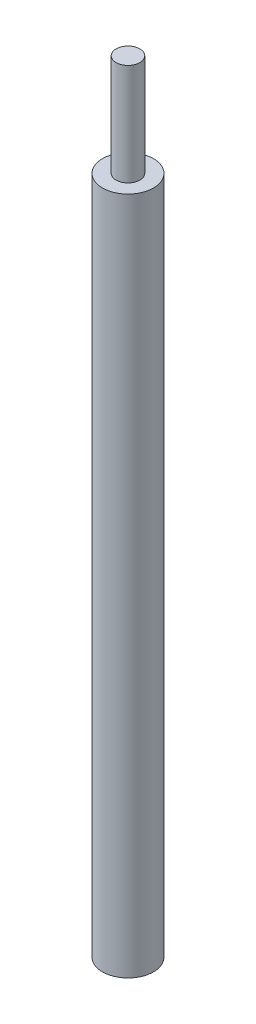
ISO-10303-21;
HEADER;
FILE_DESCRIPTION(('STEP AP214'),'2;1');
FILE_NAME('part.step','',(''),(''),'','','');
FILE_SCHEMA(('AUTOMOTIVE_DESIGN { 1 0 10303 214 1 1 1 1 }'));
ENDSEC;
DATA;
#1=APPLICATION_CONTEXT('core data for automotive mechanical design processes');
#2=APPLICATION_PROTOCOL_DEFINITION('international standard','automotive_design',2000,#1);
#3=PRODUCT_CONTEXT('',#1,'mechanical');
#4=PRODUCT('Part','Part','',(#3));
#5=PRODUCT_RELATED_PRODUCT_CATEGORY('part','',(#4));
#6=PRODUCT_DEFINITION_FORMATION('','',#4);
#7=PRODUCT_DEFINITION_CONTEXT('part definition',#1,'design');
#8=PRODUCT_DEFINITION('design','',#6,#7);
#9=PRODUCT_DEFINITION_SHAPE('','',#8);
#10=(LENGTH_UNIT() NAMED_UNIT(*) SI_UNIT(.MILLI.,.METRE.));
#11=(NAMED_UNIT(*) PLANE_ANGLE_UNIT() SI_UNIT($,.RADIAN.));
#12=(NAMED_UNIT(*) SI_UNIT($,.STERADIAN.) SOLID_ANGLE_UNIT());
#13=UNCERTAINTY_MEASURE_WITH_UNIT(LENGTH_MEASURE(1.E-05),#10,'distance_accuracy_value','');
#14=(GEOMETRIC_REPRESENTATION_CONTEXT(3) GLOBAL_UNCERTAINTY_ASSIGNED_CONTEXT((#13)) GLOBAL_UNIT_ASSIGNED_CONTEXT((#10,
#11,#12)) REPRESENTATION_CONTEXT('',''));
#15=CARTESIAN_POINT('',(0.,0.,0.));
#16=DIRECTION('',(0.,0.,1.));
#17=DIRECTION('',(1.,0.,0.));
#18=AXIS2_PLACEMENT_3D('',#15,#16,#17);
#19=CARTESIAN_POINT('',(0.,40.,0.));
#20=DIRECTION('',(0.,-1.,0.));
#21=DIRECTION('',(0.,0.,-1.));
#22=AXIS2_PLACEMENT_3D('',#19,#20,#21);
#23=CYLINDRICAL_SURFACE('',#22,1.5);
#24=CARTESIAN_POINT('',(0.,40.,0.));
#25=DIRECTION('',(0.,1.,0.));
#26=DIRECTION('',(0.,0.,1.));
#27=AXIS2_PLACEMENT_3D('',#24,#25,#26);
#28=CIRCLE('',#27,1.5);
#29=CARTESIAN_POINT('',(0.,40.,1.5));
#30=VERTEX_POINT('',#29);
#31=EDGE_CURVE('E46',#30,#30,#28,.T.);
#32=ORIENTED_EDGE('',*,*,#31,.F.);
#33=EDGE_LOOP('',(#32));
#34=FACE_BOUND('',#33,.T.);
#35=CARTESIAN_POINT('',(0.,0.,0.));
#36=DIRECTION('',(0.,1.,0.));
#37=DIRECTION('',(0.,0.,1.));
#38=AXIS2_PLACEMENT_3D('',#35,#36,#37);
#39=CIRCLE('',#38,1.5);
#40=CARTESIAN_POINT('',(0.,0.,1.5));
#41=VERTEX_POINT('',#40);
#42=EDGE_CURVE('E45',#41,#41,#39,.T.);
#43=ORIENTED_EDGE('',*,*,#42,.T.);
#44=EDGE_LOOP('',(#43));
#45=FACE_BOUND('',#44,.T.);
#46=ADVANCED_FACE('F39',(#34,#45),#23,.T.);
#47=CARTESIAN_POINT('',(0.,40.,0.));
#48=DIRECTION('',(0.,1.,0.));
#49=DIRECTION('',(0.,0.,1.));
#50=AXIS2_PLACEMENT_3D('',#47,#48,#49);
#51=PLANE('',#50);
#52=CARTESIAN_POINT('',(0.,40.,0.));
#53=DIRECTION('',(0.,1.,0.));
#54=DIRECTION('',(0.,0.,1.));
#55=AXIS2_PLACEMENT_3D('',#52,#53,#54);
#56=CIRCLE('',#55,0.7);
#57=CARTESIAN_POINT('',(0.,40.,0.7));
#58=VERTEX_POINT('',#57);
#59=EDGE_CURVE('E10',#58,#58,#56,.T.);
#60=ORIENTED_EDGE('',*,*,#59,.F.);
#61=EDGE_LOOP('',(#60));
#62=FACE_BOUND('',#61,.T.);
#63=ORIENTED_EDGE('',*,*,#31,.T.);
#64=EDGE_LOOP('',(#63));
#65=FACE_BOUND('',#64,.T.);
#66=ADVANCED_FACE('F61',(#62,#65),#51,.T.);
#67=CARTESIAN_POINT('',(0.,0.,0.));
#68=DIRECTION('',(0.,1.,0.));
#69=DIRECTION('',(0.,0.,1.));
#70=AXIS2_PLACEMENT_3D('',#67,#68,#69);
#71=PLANE('',#70);
#72=ORIENTED_EDGE('',*,*,#42,.F.);
#73=EDGE_LOOP('',(#72));
#74=FACE_BOUND('',#73,.T.);
#75=ADVANCED_FACE('F58',(#74),#71,.F.);
#76=CARTESIAN_POINT('',(0.,46.,0.));
#77=DIRECTION('',(0.,-1.,0.));
#78=DIRECTION('',(0.,0.,-1.));
#79=AXIS2_PLACEMENT_3D('',#76,#77,#78);
#80=CYLINDRICAL_SURFACE('',#79,0.7);
#81=CARTESIAN_POINT('',(0.,46.,0.));
#82=DIRECTION('',(0.,1.,0.));
#83=DIRECTION('',(0.,0.,1.));
#84=AXIS2_PLACEMENT_3D('',#81,#82,#83);
#85=CIRCLE('',#84,0.7);
#86=CARTESIAN_POINT('',(0.,46.,0.7));
#87=VERTEX_POINT('',#86);
#88=EDGE_CURVE('E55',#87,#87,#85,.T.);
#89=ORIENTED_EDGE('',*,*,#88,.F.);
#90=EDGE_LOOP('',(#89));
#91=FACE_BOUND('',#90,.T.);
#92=ORIENTED_EDGE('',*,*,#59,.T.);
#93=EDGE_LOOP('',(#92));
#94=FACE_BOUND('',#93,.T.);
#95=ADVANCED_FACE('F65',(#91,#94),#80,.T.);
#96=CARTESIAN_POINT('',(0.,46.,0.));
#97=DIRECTION('',(0.,1.,0.));
#98=DIRECTION('',(0.,0.,1.));
#99=AXIS2_PLACEMENT_3D('',#96,#97,#98);
#100=PLANE('',#99);
#101=ORIENTED_EDGE('',*,*,#88,.T.);
#102=EDGE_LOOP('',(#101));
#103=FACE_BOUND('',#102,.T.);
#104=ADVANCED_FACE('F69',(#103),#100,.T.);
#105=CLOSED_SHELL('',(#46,#66,#75,#95,#104));
#106=MANIFOLD_SOLID_BREP('B2',#105);
#107=ADVANCED_BREP_SHAPE_REPRESENTATION('',(#18,#106),#14);
#108=SHAPE_DEFINITION_REPRESENTATION(#9,#107);
ENDSEC;
END-ISO-10303-21;
